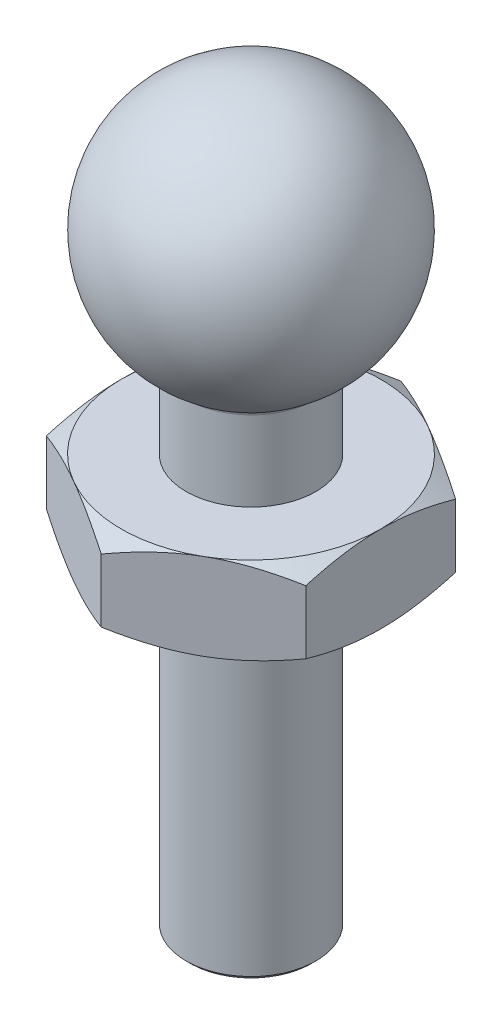
ISO-10303-21;
HEADER;
FILE_DESCRIPTION(('STEP AP214'),'2;1');
FILE_NAME('part.step','',(''),(''),'','','');
FILE_SCHEMA(('AUTOMOTIVE_DESIGN { 1 0 10303 214 1 1 1 1 }'));
ENDSEC;
DATA;
#1=APPLICATION_CONTEXT('core data for automotive mechanical design processes');
#2=APPLICATION_PROTOCOL_DEFINITION('international standard','automotive_design',2000,#1);
#3=PRODUCT_CONTEXT('',#1,'mechanical');
#4=PRODUCT('Part','Part','',(#3));
#5=PRODUCT_RELATED_PRODUCT_CATEGORY('part','',(#4));
#6=PRODUCT_DEFINITION_FORMATION('','',#4);
#7=PRODUCT_DEFINITION_CONTEXT('part definition',#1,'design');
#8=PRODUCT_DEFINITION('design','',#6,#7);
#9=PRODUCT_DEFINITION_SHAPE('','',#8);
#10=(LENGTH_UNIT() NAMED_UNIT(*) SI_UNIT(.MILLI.,.METRE.));
#11=(NAMED_UNIT(*) PLANE_ANGLE_UNIT() SI_UNIT($,.RADIAN.));
#12=(NAMED_UNIT(*) SI_UNIT($,.STERADIAN.) SOLID_ANGLE_UNIT());
#13=UNCERTAINTY_MEASURE_WITH_UNIT(LENGTH_MEASURE(1.E-05),#10,'distance_accuracy_value','');
#14=(GEOMETRIC_REPRESENTATION_CONTEXT(3) GLOBAL_UNCERTAINTY_ASSIGNED_CONTEXT((#13)) GLOBAL_UNIT_ASSIGNED_CONTEXT((#10,
#11,#12)) REPRESENTATION_CONTEXT('',''));
#15=CARTESIAN_POINT('',(0.,0.,0.));
#16=DIRECTION('',(0.,0.,1.));
#17=DIRECTION('',(1.,0.,0.));
#18=AXIS2_PLACEMENT_3D('',#15,#16,#17);
#19=CARTESIAN_POINT('',(3.,9.5,-1.73205080756888));
#20=DIRECTION('',(-0.5,0.,0.866025403784439));
#21=DIRECTION('',(0.866025403784439,0.,0.5));
#22=AXIS2_PLACEMENT_3D('',#19,#20,#21);
#23=PLANE('',#22);
#24=CARTESIAN_POINT('',(3.0002,9.23198413756899,-1.73193533751504));
#25=CARTESIAN_POINT('',(2.86836479341167,9.2759462955477,-1.80805042952748));
#26=CARTESIAN_POINT('',(2.73539159464475,9.31592841370737,-1.88482254163057));
#27=CARTESIAN_POINT('',(2.46714257999794,9.38571791955454,-2.03969618244675));
#28=CARTESIAN_POINT('',(2.33186199736566,9.41550061773462,-2.11780046324563));
#29=CARTESIAN_POINT('',(2.06297739790352,9.46186216078875,-2.27304105912605));
#30=CARTESIAN_POINT('',(1.92941475457054,9.47874955887705,-2.35015348720802));
#31=CARTESIAN_POINT('',(1.66166094270431,9.49891035755148,-2.50474122256553));
#32=CARTESIAN_POINT('',(1.52747074752016,9.50220045221892,-2.58221596787771));
#33=CARTESIAN_POINT('',(1.27672440230419,9.49535946911461,-2.72698443778646));
#34=CARTESIAN_POINT('',(1.16013073502732,9.48690808580739,-2.79429982297457));
#35=CARTESIAN_POINT('',(0.927703015025363,9.46012105699297,-2.92849202968483));
#36=CARTESIAN_POINT('',(0.811869766348668,9.44177625913829,-2.99536838698943));
#37=CARTESIAN_POINT('',(0.578962742943631,9.39591524914668,-3.12983731964848));
#38=CARTESIAN_POINT('',(0.461918449486058,9.36820461473692,-3.19741287398332));
#39=CARTESIAN_POINT('',(0.229575649500875,9.3053122048626,-3.33155605209904));
#40=CARTESIAN_POINT('',(0.114274165828893,9.27014520897844,-3.39812539473502));
#41=CARTESIAN_POINT('',(-0.000200000000000737,9.23198413756899,-3.46421708519159));
#42=B_SPLINE_CURVE_WITH_KNOTS('',3,(#24,#25,#26,#27,#28,#29,#30,#31,#32,#33,#34,#35,#36,#37,#38,
#39,#40,#41),.UNSPECIFIED.,.F.,.F.,(4,2,2,2,2,2,2,2,4),(0.,0.47553983010304,0.952222784107964,
1.41710776961288,1.88142182298026,2.28572436316091,2.69040156475039,3.10405572063576,
3.5168974940707),.UNSPECIFIED.);
#43=CARTESIAN_POINT('',(3.,9.2320508075689,-1.73205080756891));
#44=VERTEX_POINT('',#43);
#45=CARTESIAN_POINT('',(1.5,9.5,-2.59807621135332));
#46=VERTEX_POINT('',#45);
#47=EDGE_CURVE('E138',#44,#46,#42,.T.);
#48=ORIENTED_EDGE('',*,*,#47,.F.);
#49=DIRECTION('',(0.,-1.,0.));
#50=VECTOR('',#49,1.);
#51=CARTESIAN_POINT('',(3.,9.5,-1.73205080756888));
#52=LINE('',#51,#50);
#53=CARTESIAN_POINT('',(3.,7.76794919243112,-1.73205080756888));
#54=VERTEX_POINT('',#53);
#55=EDGE_CURVE('E247',#44,#54,#52,.T.);
#56=ORIENTED_EDGE('',*,*,#55,.T.);
#57=CARTESIAN_POINT('',(-0.000200000000000841,7.76801586243101,-3.46421708519159));
#58=CARTESIAN_POINT('',(0.131635206588331,7.72405370445231,-3.38810199317915));
#59=CARTESIAN_POINT('',(0.264608405355249,7.68407158629263,-3.31132988107606));
#60=CARTESIAN_POINT('',(0.532857420002056,7.61428208044547,-3.15645624025988));
#61=CARTESIAN_POINT('',(0.668138002634341,7.58449938226538,-3.078351959461));
#62=CARTESIAN_POINT('',(0.937022602096483,7.53813783921126,-2.92311136358059));
#63=CARTESIAN_POINT('',(1.07058524542946,7.52125044112295,-2.84599893549861));
#64=CARTESIAN_POINT('',(1.33833905729569,7.50108964244852,-2.6914112001411));
#65=CARTESIAN_POINT('',(1.47252925247984,7.49779954778108,-2.61393645482892));
#66=CARTESIAN_POINT('',(1.72327559769581,7.50464053088539,-2.46916798492017));
#67=CARTESIAN_POINT('',(1.83986926497268,7.51309191419262,-2.40185259973206));
#68=CARTESIAN_POINT('',(2.07229698497464,7.53987894300704,-2.2676603930218));
#69=CARTESIAN_POINT('',(2.18813023365133,7.55822374086171,-2.2007840357172));
#70=CARTESIAN_POINT('',(2.42103725705637,7.60408475085333,-2.06631510305815));
#71=CARTESIAN_POINT('',(2.53808155051394,7.63179538526308,-1.99873954872331));
#72=CARTESIAN_POINT('',(2.77042435049913,7.6946877951374,-1.86459637060759));
#73=CARTESIAN_POINT('',(2.88572583417111,7.72985479102156,-1.79802702797161));
#74=CARTESIAN_POINT('',(3.0002,7.76801586243101,-1.73193533751504));
#75=B_SPLINE_CURVE_WITH_KNOTS('',3,(#57,#58,#59,#60,#61,#62,#63,#64,#65,#66,#67,#68,#69,#70,#71,
#72,#73,#74),.UNSPECIFIED.,.F.,.F.,(4,2,2,2,2,2,2,2,4),(0.,0.475539830103041,0.952222784107964,
1.41710776961288,1.88142182298026,2.28572436316091,2.69040156475039,3.10405572063576,
3.5168974940707),.UNSPECIFIED.);
#76=CARTESIAN_POINT('',(1.5,7.5,-2.59807621135332));
#77=VERTEX_POINT('',#76);
#78=EDGE_CURVE('E287',#77,#54,#75,.T.);
#79=ORIENTED_EDGE('',*,*,#78,.F.);
#80=CARTESIAN_POINT('',(0.,7.76794919243112,-3.46410161513775));
#81=VERTEX_POINT('',#80);
#82=EDGE_CURVE('E294',#81,#77,#75,.T.);
#83=ORIENTED_EDGE('',*,*,#82,.F.);
#84=DIRECTION('',(0.,-1.,0.));
#85=VECTOR('',#84,1.);
#86=CARTESIAN_POINT('',(0.,9.5,-3.46410161513775));
#87=LINE('',#86,#85);
#88=CARTESIAN_POINT('',(0.,9.23205080756888,-3.46410161513775));
#89=VERTEX_POINT('',#88);
#90=EDGE_CURVE('E161',#89,#81,#87,.T.);
#91=ORIENTED_EDGE('',*,*,#90,.F.);
#92=EDGE_CURVE('E147',#46,#89,#42,.T.);
#93=ORIENTED_EDGE('',*,*,#92,.F.);
#94=EDGE_LOOP('',(#48,#56,#79,#83,#91,#93));
#95=FACE_BOUND('',#94,.T.);
#96=ADVANCED_FACE('F50',(#95),#23,.F.);
#97=CARTESIAN_POINT('',(0.,9.5,-3.46410161513775));
#98=DIRECTION('',(0.5,0.,0.866025403784439));
#99=DIRECTION('',(0.866025403784439,0.,-0.5));
#100=AXIS2_PLACEMENT_3D('',#97,#98,#99);
#101=PLANE('',#100);
#102=CARTESIAN_POINT('',(0.000199999999999262,9.23198413756899,-3.46421708519159));
#103=CARTESIAN_POINT('',(-0.131635206588332,9.2759462955477,-3.38810199317915));
#104=CARTESIAN_POINT('',(-0.26460840535525,9.31592841370737,-3.31132988107606));
#105=CARTESIAN_POINT('',(-0.532857420002056,9.38571791955454,-3.15645624025988));
#106=CARTESIAN_POINT('',(-0.668138002634342,9.41550061773462,-3.078351959461));
#107=CARTESIAN_POINT('',(-0.937022602096484,9.46186216078875,-2.92311136358059));
#108=CARTESIAN_POINT('',(-1.07058524542946,9.47874955887705,-2.84599893549861));
#109=CARTESIAN_POINT('',(-1.33833905729569,9.49891035755148,-2.6914112001411));
#110=CARTESIAN_POINT('',(-1.47252925247984,9.50220045221892,-2.61393645482892));
#111=CARTESIAN_POINT('',(-1.72327559769581,9.49535946911461,-2.46916798492017));
#112=CARTESIAN_POINT('',(-1.83986926497268,9.48690808580738,-2.40185259973206));
#113=CARTESIAN_POINT('',(-2.07229698497464,9.46012105699297,-2.2676603930218));
#114=CARTESIAN_POINT('',(-2.18813023365133,9.44177625913829,-2.2007840357172));
#115=CARTESIAN_POINT('',(-2.42103725705637,9.39591524914668,-2.06631510305815));
#116=CARTESIAN_POINT('',(-2.53808155051394,9.36820461473692,-1.99873954872331));
#117=CARTESIAN_POINT('',(-2.77042435049912,9.3053122048626,-1.86459637060759));
#118=CARTESIAN_POINT('',(-2.8857258341711,9.27014520897845,-1.79802702797161));
#119=CARTESIAN_POINT('',(-3.0002,9.23198413756899,-1.73193533751504));
#120=B_SPLINE_CURVE_WITH_KNOTS('',3,(#102,#103,#104,#105,#106,#107,#108,#109,#110,#111,#112,
#113,#114,#115,#116,#117,#118,#119),.UNSPECIFIED.,.F.,.F.,(4,2,2,2,2,2,2,2,4),(0.,
0.475539830103041,0.952222784107964,1.41710776961288,1.88142182298026,2.28572436316091,
2.69040156475039,3.10405572063576,3.5168974940707),.UNSPECIFIED.);
#121=CARTESIAN_POINT('',(-1.5,9.5,-2.59807621135332));
#122=VERTEX_POINT('',#121);
#123=EDGE_CURVE('E153',#89,#122,#120,.T.);
#124=ORIENTED_EDGE('',*,*,#123,.F.);
#125=ORIENTED_EDGE('',*,*,#90,.T.);
#126=CARTESIAN_POINT('',(-3.0002,7.76801586243101,-1.73193533751504));
#127=CARTESIAN_POINT('',(-2.86836479341167,7.72405370445231,-1.80805042952748));
#128=CARTESIAN_POINT('',(-2.73539159464475,7.68407158629263,-1.88482254163057));
#129=CARTESIAN_POINT('',(-2.46714257999794,7.61428208044547,-2.03969618244675));
#130=CARTESIAN_POINT('',(-2.33186199736566,7.58449938226538,-2.11780046324563));
#131=CARTESIAN_POINT('',(-2.06297739790352,7.53813783921126,-2.27304105912605));
#132=CARTESIAN_POINT('',(-1.92941475457054,7.52125044112295,-2.35015348720802));
#133=CARTESIAN_POINT('',(-1.66166094270431,7.50108964244852,-2.50474122256553));
#134=CARTESIAN_POINT('',(-1.52747074752016,7.49779954778108,-2.58221596787771));
#135=CARTESIAN_POINT('',(-1.27672440230419,7.50464053088539,-2.72698443778647));
#136=CARTESIAN_POINT('',(-1.16013073502732,7.51309191419262,-2.79429982297457));
#137=CARTESIAN_POINT('',(-0.927703015025364,7.53987894300704,-2.92849202968483));
#138=CARTESIAN_POINT('',(-0.811869766348669,7.55822374086171,-2.99536838698943));
#139=CARTESIAN_POINT('',(-0.578962742943633,7.60408475085333,-3.12983731964848));
#140=CARTESIAN_POINT('',(-0.461918449486061,7.63179538526308,-3.19741287398332));
#141=CARTESIAN_POINT('',(-0.229575649500877,7.6946877951374,-3.33155605209904));
#142=CARTESIAN_POINT('',(-0.114274165828895,7.72985479102156,-3.39812539473502));
#143=CARTESIAN_POINT('',(0.000199999999998709,7.76801586243101,-3.46421708519159));
#144=B_SPLINE_CURVE_WITH_KNOTS('',3,(#126,#127,#128,#129,#130,#131,#132,#133,#134,#135,#136,
#137,#138,#139,#140,#141,#142,#143),.UNSPECIFIED.,.F.,.F.,(4,2,2,2,2,2,2,2,4),(0.,
0.475539830103039,0.952222784107963,1.41710776961288,1.88142182298026,2.28572436316091,
2.69040156475039,3.10405572063576,3.5168974940707),.UNSPECIFIED.);
#145=CARTESIAN_POINT('',(-1.5,7.5,-2.59807621135332));
#146=VERTEX_POINT('',#145);
#147=EDGE_CURVE('E238',#146,#81,#144,.T.);
#148=ORIENTED_EDGE('',*,*,#147,.F.);
#149=CARTESIAN_POINT('',(-3.,7.76794919243112,-1.73205080756888));
#150=VERTEX_POINT('',#149);
#151=EDGE_CURVE('E306',#150,#146,#144,.T.);
#152=ORIENTED_EDGE('',*,*,#151,.F.);
#153=DIRECTION('',(0.,-1.,0.));
#154=VECTOR('',#153,1.);
#155=CARTESIAN_POINT('',(-3.,9.5,-1.73205080756888));
#156=LINE('',#155,#154);
#157=CARTESIAN_POINT('',(-3.,9.23205080756888,-1.73205080756888));
#158=VERTEX_POINT('',#157);
#159=EDGE_CURVE('E258',#158,#150,#156,.T.);
#160=ORIENTED_EDGE('',*,*,#159,.F.);
#161=EDGE_CURVE('E162',#122,#158,#120,.T.);
#162=ORIENTED_EDGE('',*,*,#161,.F.);
#163=EDGE_LOOP('',(#124,#125,#148,#152,#160,#162));
#164=FACE_BOUND('',#163,.T.);
#165=ADVANCED_FACE('F222',(#164),#101,.F.);
#166=CARTESIAN_POINT('',(-3.,9.5,-1.73205080756888));
#167=DIRECTION('',(1.,0.,0.));
#168=DIRECTION('',(0.,0.,-1.));
#169=AXIS2_PLACEMENT_3D('',#166,#167,#168);
#170=PLANE('',#169);
#171=CARTESIAN_POINT('',(-3.,7.49669275597267,-5.73225080756888));
#172=CARTESIAN_POINT('',(-3.,7.56535762873895,-5.59799811373669));
#173=CARTESIAN_POINT('',(-3.,7.63362658074956,-5.46354106552017));
#174=CARTESIAN_POINT('',(-3.,7.76917519775031,-5.19412594711896));
#175=CARTESIAN_POINT('',(-3.,7.83645484167597,-5.05916786634262));
#176=CARTESIAN_POINT('',(-3.,7.96993872408742,-4.78843231789163));
#177=CARTESIAN_POINT('',(-3.,8.0361409223391,-4.65265384244875));
#178=CARTESIAN_POINT('',(-3.,8.16708055525372,-4.38038885038152));
#179=CARTESIAN_POINT('',(-3.,8.23181796851999,-4.24390232345014));
#180=CARTESIAN_POINT('',(-3.,8.36273075239076,-3.96310511366176));
#181=CARTESIAN_POINT('',(-3.,8.42881132731156,-3.81875010473635));
#182=CARTESIAN_POINT('',(-3.,8.55842928727965,-3.52890389215656));
#183=CARTESIAN_POINT('',(-3.,8.62196674541402,-3.38341272129836));
#184=CARTESIAN_POINT('',(-3.,8.74573518476893,-3.0911428032025));
#185=CARTESIAN_POINT('',(-3.,8.80596844827942,-2.94436502804428));
#186=CARTESIAN_POINT('',(-3.,8.92221294586851,-2.64909731827644));
#187=CARTESIAN_POINT('',(-3.,8.97822314680859,-2.50060697487877));
#188=CARTESIAN_POINT('',(-3.,9.09420348606466,-2.17495473766773));
#189=CARTESIAN_POINT('',(-3.,9.15309774811247,-1.99740334689548));
#190=CARTESIAN_POINT('',(-3.,9.26029523419007,-1.63917764376158));
#191=CARTESIAN_POINT('',(-3.,9.30860404614459,-1.45850503366086));
#192=CARTESIAN_POINT('',(-3.,9.39023263279609,-1.09720914532956));
#193=CARTESIAN_POINT('',(-3.,9.42381477693698,-0.916647599895757));
#194=CARTESIAN_POINT('',(-3.,9.46126742176692,-0.644079261802787));
#195=CARTESIAN_POINT('',(-3.,9.47159787377879,-0.552943422867094));
#196=CARTESIAN_POINT('',(-3.,9.48763454600052,-0.370270654947727));
#197=CARTESIAN_POINT('',(-3.,9.49334144079801,-0.278733786435309));
#198=CARTESIAN_POINT('',(-3.,9.49996614854262,-0.0944078517722086));
#199=CARTESIAN_POINT('',(-3.,9.5008268616344,-0.00161671746076026));
#200=CARTESIAN_POINT('',(-3.,9.49757525562797,0.1838775984138));
#201=CARTESIAN_POINT('',(-3.,9.49346292019229,0.276580779686968));
#202=CARTESIAN_POINT('',(-3.,9.48041370767168,0.461668088480514));
#203=CARTESIAN_POINT('',(-3.,9.47147558711607,0.554052127589443));
#204=CARTESIAN_POINT('',(-3.,9.4490819835307,0.738276464049773));
#205=CARTESIAN_POINT('',(-3.,9.43562578745626,0.830116673244043));
#206=CARTESIAN_POINT('',(-3.,9.38848678345654,1.1081241349506));
#207=CARTESIAN_POINT('',(-3.,9.34831083516922,1.29320289274649));
#208=CARTESIAN_POINT('',(-3.,9.25483304091392,1.65992833453579));
#209=CARTESIAN_POINT('',(-3.,9.20152817481691,1.8415742184766));
#210=CARTESIAN_POINT('',(-3.,9.09001482170303,2.18718321983853));
#211=CARTESIAN_POINT('',(-3.,9.03254960886739,2.35139002090273));
#212=CARTESIAN_POINT('',(-3.,8.91157770593577,2.67757637701535));
#213=CARTESIAN_POINT('',(-3.,8.84806982210383,2.83955548471668));
#214=CARTESIAN_POINT('',(-3.,8.71649668995848,3.16180541641892));
#215=CARTESIAN_POINT('',(-3.,8.64842746398323,3.32207460435457));
#216=CARTESIAN_POINT('',(-3.,8.50888164672137,3.64112437712565));
#217=CARTESIAN_POINT('',(-3.,8.43740489080743,3.79990488959462));
#218=CARTESIAN_POINT('',(-3.,8.29572041514807,4.10783154121877));
#219=CARTESIAN_POINT('',(-3.,8.22564804300013,4.25704019529893));
#220=CARTESIAN_POINT('',(-3.,8.0836551872923,4.55457880885657));
#221=CARTESIAN_POINT('',(-3.,8.01173465191385,4.70290874355283));
#222=CARTESIAN_POINT('',(-3.,7.86663085724281,4.99841900754648));
#223=CARTESIAN_POINT('',(-3.,7.79345182235509,5.14560141584992));
#224=CARTESIAN_POINT('',(-3.,7.64590152942626,5.43935321353677));
#225=CARTESIAN_POINT('',(-3.,7.57153036655204,5.58592265068707));
#226=CARTESIAN_POINT('',(-3.,7.49669275597267,5.73225080756888));
#227=B_SPLINE_CURVE_WITH_KNOTS('',3,(#171,#172,#173,#174,#175,#176,#177,#178,#179,#180,#181,
#182,#183,#184,#185,#186,#187,#188,#189,#190,#191,#192,#193,#194,#195,#196,#197,#198,#199,#200,
#201,#202,#203,#204,#205,#206,#207,#208,#209,#210,#211,#212,#213,#214,#215,#216,#217,#218,#219,
#220,#221,#222,#223,#224,#225,#226),.UNSPECIFIED.,.F.,.F.,(4,2,2,2,2,2,2,2,2,2,2,2,2,2,2,2,2,2,
2,2,2,2,2,2,2,2,2,4),(0.,0.452382016001323,0.90477365026535,1.35794045354517,1.81111387213612,
2.2873771437625,2.76362671813268,3.23954308217786,3.71557550010852,4.27652369616462,
4.83717505756687,5.38738613645124,5.66244417939779,5.937462083513,6.21571369559986,
6.4939662218021,6.77229048018743,7.05065868449287,7.61810965270507,8.18569127741243,
8.70745206667822,9.2293161451901,9.75164138486646,10.2739918851653,10.7685068932809,
11.2630357817083,11.756143015984,12.2492110799155),.UNSPECIFIED.);
#228=CARTESIAN_POINT('',(-3.,9.5,0.));
#229=VERTEX_POINT('',#228);
#230=EDGE_CURVE('E216',#158,#229,#227,.T.);
#231=ORIENTED_EDGE('',*,*,#230,.F.);
#232=ORIENTED_EDGE('',*,*,#159,.T.);
#233=CARTESIAN_POINT('',(-3.,9.50330724402733,5.73225080756888));
#234=CARTESIAN_POINT('',(-3.,9.43464237126106,5.59799811373669));
#235=CARTESIAN_POINT('',(-3.,9.36637341925044,5.46354106552018));
#236=CARTESIAN_POINT('',(-3.,9.2308248022497,5.19412594711896));
#237=CARTESIAN_POINT('',(-3.,9.16354515832403,5.05916786634262));
#238=CARTESIAN_POINT('',(-3.,9.03006127591258,4.78843231789163));
#239=CARTESIAN_POINT('',(-3.,8.9638590776609,4.65265384244875));
#240=CARTESIAN_POINT('',(-3.,8.83291944474628,4.38038885038151));
#241=CARTESIAN_POINT('',(-3.,8.76818203148001,4.24390232345014));
#242=CARTESIAN_POINT('',(-3.,8.63726924760924,3.96310511366176));
#243=CARTESIAN_POINT('',(-3.,8.57118867268844,3.81875010473635));
#244=CARTESIAN_POINT('',(-3.,8.44157071272035,3.52890389215656));
#245=CARTESIAN_POINT('',(-3.,8.37803325458598,3.38341272129836));
#246=CARTESIAN_POINT('',(-3.,8.25426481523107,3.0911428032025));
#247=CARTESIAN_POINT('',(-3.,8.19403155172058,2.94436502804428));
#248=CARTESIAN_POINT('',(-3.,8.07778705413149,2.64909731827644));
#249=CARTESIAN_POINT('',(-3.,8.02177685319141,2.50060697487877));
#250=CARTESIAN_POINT('',(-3.,7.90579651393534,2.17495473766773));
#251=CARTESIAN_POINT('',(-3.,7.84690225188754,1.99740334689548));
#252=CARTESIAN_POINT('',(-3.,7.73970476580994,1.63917764376158));
#253=CARTESIAN_POINT('',(-3.,7.69139595385541,1.45850503366086));
#254=CARTESIAN_POINT('',(-3.,7.60976736720391,1.09720914532956));
#255=CARTESIAN_POINT('',(-3.,7.57618522306302,0.916647599895758));
#256=CARTESIAN_POINT('',(-3.,7.53873257823308,0.644079261802788));
#257=CARTESIAN_POINT('',(-3.,7.52840212622122,0.552943422867095));
#258=CARTESIAN_POINT('',(-3.,7.51236545399948,0.370270654947728));
#259=CARTESIAN_POINT('',(-3.,7.50665855920199,0.27873378643531));
#260=CARTESIAN_POINT('',(-3.,7.50003385145738,0.0944078517722091));
#261=CARTESIAN_POINT('',(-3.,7.4991731383656,0.00161671746076089));
#262=CARTESIAN_POINT('',(-3.,7.50242474437203,-0.1838775984138));
#263=CARTESIAN_POINT('',(-3.,7.50653707980771,-0.276580779686967));
#264=CARTESIAN_POINT('',(-3.,7.51958629232832,-0.461668088480514));
#265=CARTESIAN_POINT('',(-3.,7.52852441288393,-0.554052127589442));
#266=CARTESIAN_POINT('',(-3.,7.5509180164693,-0.738276464049773));
#267=CARTESIAN_POINT('',(-3.,7.56437421254374,-0.830116673244042));
#268=CARTESIAN_POINT('',(-3.,7.61151321654347,-1.1081241349506));
#269=CARTESIAN_POINT('',(-3.,7.65168916483078,-1.29320289274649));
#270=CARTESIAN_POINT('',(-3.,7.74516695908608,-1.65992833453579));
#271=CARTESIAN_POINT('',(-3.,7.79847182518309,-1.8415742184766));
#272=CARTESIAN_POINT('',(-3.,7.90998517829698,-2.18718321983853));
#273=CARTESIAN_POINT('',(-3.,7.96745039113262,-2.35139002090273));
#274=CARTESIAN_POINT('',(-3.,8.08842229406424,-2.67757637701535));
#275=CARTESIAN_POINT('',(-3.,8.15193017789617,-2.83955548471668));
#276=CARTESIAN_POINT('',(-3.,8.28350331004152,-3.16180541641892));
#277=CARTESIAN_POINT('',(-3.,8.35157253601678,-3.32207460435457));
#278=CARTESIAN_POINT('',(-3.,8.49111835327863,-3.64112437712565));
#279=CARTESIAN_POINT('',(-3.,8.56259510919257,-3.79990488959462));
#280=CARTESIAN_POINT('',(-3.,8.70427958485193,-4.10783154121877));
#281=CARTESIAN_POINT('',(-3.,8.77435195699988,-4.25704019529893));
#282=CARTESIAN_POINT('',(-3.,8.9163448127077,-4.55457880885657));
#283=CARTESIAN_POINT('',(-3.,8.98826534808616,-4.70290874355283));
#284=CARTESIAN_POINT('',(-3.,9.13336914275719,-4.99841900754648));
#285=CARTESIAN_POINT('',(-3.,9.20654817764491,-5.14560141584992));
#286=CARTESIAN_POINT('',(-3.,9.35409847057374,-5.43935321353677));
#287=CARTESIAN_POINT('',(-3.,9.42846963344796,-5.58592265068707));
#288=CARTESIAN_POINT('',(-3.,9.50330724402733,-5.73225080756888));
#289=B_SPLINE_CURVE_WITH_KNOTS('',3,(#233,#234,#235,#236,#237,#238,#239,#240,#241,#242,#243,
#244,#245,#246,#247,#248,#249,#250,#251,#252,#253,#254,#255,#256,#257,#258,#259,#260,#261,#262,
#263,#264,#265,#266,#267,#268,#269,#270,#271,#272,#273,#274,#275,#276,#277,#278,#279,#280,#281,
#282,#283,#284,#285,#286,#287,#288),.UNSPECIFIED.,.F.,.F.,(4,2,2,2,2,2,2,2,2,2,2,2,2,2,2,2,2,2,
2,2,2,2,2,2,2,2,2,4),(0.,0.452382016001322,0.904773650265349,1.35794045354517,1.81111387213612,
2.2873771437625,2.76362671813268,3.23954308217786,3.71557550010852,4.27652369616462,
4.83717505756687,5.38738613645124,5.66244417939779,5.937462083513,6.21571369559986,
6.4939662218021,6.77229048018743,7.05065868449287,7.61810965270507,8.18569127741243,
8.70745206667822,9.2293161451901,9.75164138486645,10.2739918851653,10.7685068932809,
11.2630357817083,11.756143015984,12.2492110799155),.UNSPECIFIED.);
#290=CARTESIAN_POINT('',(-3.,7.5,0.));
#291=VERTEX_POINT('',#290);
#292=EDGE_CURVE('E228',#291,#150,#289,.T.);
#293=ORIENTED_EDGE('',*,*,#292,.F.);
#294=CARTESIAN_POINT('',(-3.,7.76794919243112,1.73205080756888));
#295=VERTEX_POINT('',#294);
#296=EDGE_CURVE('E236',#295,#291,#289,.T.);
#297=ORIENTED_EDGE('',*,*,#296,.F.);
#298=DIRECTION('',(0.,-1.,0.));
#299=VECTOR('',#298,1.);
#300=CARTESIAN_POINT('',(-3.,9.5,1.73205080756888));
#301=LINE('',#300,#299);
#302=CARTESIAN_POINT('',(-3.,9.23205080756888,1.73205080756888));
#303=VERTEX_POINT('',#302);
#304=EDGE_CURVE('E256',#303,#295,#301,.T.);
#305=ORIENTED_EDGE('',*,*,#304,.F.);
#306=EDGE_CURVE('E210',#229,#303,#227,.T.);
#307=ORIENTED_EDGE('',*,*,#306,.F.);
#308=EDGE_LOOP('',(#231,#232,#293,#297,#305,#307));
#309=FACE_BOUND('',#308,.T.);
#310=ADVANCED_FACE('F218',(#309),#170,.F.);
#311=CARTESIAN_POINT('',(-3.,9.5,1.73205080756888));
#312=DIRECTION('',(0.5,0.,-0.866025403784439));
#313=DIRECTION('',(-0.866025403784439,0.,-0.5));
#314=AXIS2_PLACEMENT_3D('',#311,#312,#313);
#315=PLANE('',#314);
#316=CARTESIAN_POINT('',(-3.0002,9.23198413756899,1.73193533751504));
#317=CARTESIAN_POINT('',(-2.86836479341167,9.2759462955477,1.80805042952748));
#318=CARTESIAN_POINT('',(-2.73539159464475,9.31592841370737,1.88482254163057));
#319=CARTESIAN_POINT('',(-2.46714257999794,9.38571791955454,2.03969618244675));
#320=CARTESIAN_POINT('',(-2.33186199736566,9.41550061773462,2.11780046324563));
#321=CARTESIAN_POINT('',(-2.06297739790352,9.46186216078875,2.27304105912605));
#322=CARTESIAN_POINT('',(-1.92941475457054,9.47874955887705,2.35015348720802));
#323=CARTESIAN_POINT('',(-1.66166094270431,9.49891035755148,2.50474122256553));
#324=CARTESIAN_POINT('',(-1.52747074752016,9.50220045221892,2.58221596787771));
#325=CARTESIAN_POINT('',(-1.27672440230419,9.49535946911461,2.72698443778647));
#326=CARTESIAN_POINT('',(-1.16013073502732,9.48690808580738,2.79429982297457));
#327=CARTESIAN_POINT('',(-0.927703015025363,9.46012105699297,2.92849202968483));
#328=CARTESIAN_POINT('',(-0.811869766348668,9.44177625913829,2.99536838698943));
#329=CARTESIAN_POINT('',(-0.578962742943632,9.39591524914668,3.12983731964848));
#330=CARTESIAN_POINT('',(-0.461918449486059,9.36820461473692,3.19741287398332));
#331=CARTESIAN_POINT('',(-0.229575649500875,9.3053122048626,3.33155605209904));
#332=CARTESIAN_POINT('',(-0.114274165828894,9.27014520897844,3.39812539473502));
#333=CARTESIAN_POINT('',(0.000199999999999832,9.23198413756899,3.46421708519159));
#334=B_SPLINE_CURVE_WITH_KNOTS('',3,(#316,#317,#318,#319,#320,#321,#322,#323,#324,#325,#326,
#327,#328,#329,#330,#331,#332,#333),.UNSPECIFIED.,.F.,.F.,(4,2,2,2,2,2,2,2,4),(0.,
0.475539830103041,0.952222784107964,1.41710776961288,1.88142182298026,2.28572436316091,
2.69040156475039,3.10405572063576,3.5168974940707),.UNSPECIFIED.);
#335=CARTESIAN_POINT('',(-1.5,9.5,2.59807621135332));
#336=VERTEX_POINT('',#335);
#337=EDGE_CURVE('E217',#303,#336,#334,.T.);
#338=ORIENTED_EDGE('',*,*,#337,.F.);
#339=ORIENTED_EDGE('',*,*,#304,.T.);
#340=CARTESIAN_POINT('',(0.0002,7.76801586243101,3.46421708519159));
#341=CARTESIAN_POINT('',(-0.131635206588332,7.72405370445231,3.38810199317915));
#342=CARTESIAN_POINT('',(-0.264608405355249,7.68407158629263,3.31132988107606));
#343=CARTESIAN_POINT('',(-0.532857420002056,7.61428208044547,3.15645624025988));
#344=CARTESIAN_POINT('',(-0.668138002634342,7.58449938226538,3.078351959461));
#345=CARTESIAN_POINT('',(-0.937022602096483,7.53813783921126,2.92311136358059));
#346=CARTESIAN_POINT('',(-1.07058524542946,7.52125044112295,2.84599893549861));
#347=CARTESIAN_POINT('',(-1.33833905729569,7.50108964244852,2.6914112001411));
#348=CARTESIAN_POINT('',(-1.47252925247984,7.49779954778108,2.61393645482892));
#349=CARTESIAN_POINT('',(-1.72327559769581,7.50464053088539,2.46916798492017));
#350=CARTESIAN_POINT('',(-1.83986926497268,7.51309191419262,2.40185259973206));
#351=CARTESIAN_POINT('',(-2.07229698497464,7.53987894300704,2.2676603930218));
#352=CARTESIAN_POINT('',(-2.18813023365133,7.55822374086171,2.2007840357172));
#353=CARTESIAN_POINT('',(-2.42103725705637,7.60408475085333,2.06631510305815));
#354=CARTESIAN_POINT('',(-2.53808155051394,7.63179538526308,1.99873954872331));
#355=CARTESIAN_POINT('',(-2.77042435049912,7.6946877951374,1.86459637060759));
#356=CARTESIAN_POINT('',(-2.88572583417111,7.72985479102156,1.79802702797161));
#357=CARTESIAN_POINT('',(-3.0002,7.76801586243101,1.73193533751504));
#358=B_SPLINE_CURVE_WITH_KNOTS('',3,(#340,#341,#342,#343,#344,#345,#346,#347,#348,#349,#350,
#351,#352,#353,#354,#355,#356,#357),.UNSPECIFIED.,.F.,.F.,(4,2,2,2,2,2,2,2,4),(0.,
0.475539830103041,0.952222784107964,1.41710776961288,1.88142182298026,2.28572436316091,
2.69040156475039,3.10405572063576,3.5168974940707),.UNSPECIFIED.);
#359=CARTESIAN_POINT('',(-1.5,7.5,2.59807621135332));
#360=VERTEX_POINT('',#359);
#361=EDGE_CURVE('E237',#360,#295,#358,.T.);
#362=ORIENTED_EDGE('',*,*,#361,.F.);
#363=CARTESIAN_POINT('',(0.,7.76794919243112,3.46410161513775));
#364=VERTEX_POINT('',#363);
#365=EDGE_CURVE('E295',#364,#360,#358,.T.);
#366=ORIENTED_EDGE('',*,*,#365,.F.);
#367=DIRECTION('',(0.,-1.,0.));
#368=VECTOR('',#367,1.);
#369=CARTESIAN_POINT('',(0.,9.5,3.46410161513775));
#370=LINE('',#369,#368);
#371=CARTESIAN_POINT('',(0.,9.23205080756888,3.46410161513775));
#372=VERTEX_POINT('',#371);
#373=EDGE_CURVE('E254',#372,#364,#370,.T.);
#374=ORIENTED_EDGE('',*,*,#373,.F.);
#375=EDGE_CURVE('E204',#336,#372,#334,.T.);
#376=ORIENTED_EDGE('',*,*,#375,.F.);
#377=EDGE_LOOP('',(#338,#339,#362,#366,#374,#376));
#378=FACE_BOUND('',#377,.T.);
#379=ADVANCED_FACE('F221',(#378),#315,.F.);
#380=CARTESIAN_POINT('',(0.,9.5,3.46410161513775));
#381=DIRECTION('',(-0.5,0.,-0.866025403784439));
#382=DIRECTION('',(-0.866025403784439,0.,0.5));
#383=AXIS2_PLACEMENT_3D('',#380,#381,#382);
#384=PLANE('',#383);
#385=CARTESIAN_POINT('',(-0.000200000000000161,9.23198413756899,3.46421708519159));
#386=CARTESIAN_POINT('',(0.131635206588331,9.2759462955477,3.38810199317915));
#387=CARTESIAN_POINT('',(0.264608405355249,9.31592841370737,3.31132988107606));
#388=CARTESIAN_POINT('',(0.532857420002055,9.38571791955454,3.15645624025988));
#389=CARTESIAN_POINT('',(0.668138002634341,9.41550061773462,3.078351959461));
#390=CARTESIAN_POINT('',(0.937022602096483,9.46186216078875,2.92311136358059));
#391=CARTESIAN_POINT('',(1.07058524542946,9.47874955887705,2.84599893549861));
#392=CARTESIAN_POINT('',(1.33833905729569,9.49891035755148,2.6914112001411));
#393=CARTESIAN_POINT('',(1.47252925247984,9.50220045221892,2.61393645482892));
#394=CARTESIAN_POINT('',(1.72327559769581,9.49535946911461,2.46916798492017));
#395=CARTESIAN_POINT('',(1.83986926497268,9.48690808580738,2.40185259973206));
#396=CARTESIAN_POINT('',(2.07229698497464,9.46012105699296,2.2676603930218));
#397=CARTESIAN_POINT('',(2.18813023365133,9.44177625913829,2.2007840357172));
#398=CARTESIAN_POINT('',(2.42103725705637,9.39591524914667,2.06631510305815));
#399=CARTESIAN_POINT('',(2.53808155051394,9.36820461473692,1.99873954872331));
#400=CARTESIAN_POINT('',(2.77042435049913,9.3053122048626,1.86459637060759));
#401=CARTESIAN_POINT('',(2.88572583417111,9.27014520897845,1.79802702797161));
#402=CARTESIAN_POINT('',(3.0002,9.23198413756899,1.73193533751504));
#403=B_SPLINE_CURVE_WITH_KNOTS('',3,(#385,#386,#387,#388,#389,#390,#391,#392,#393,#394,#395,
#396,#397,#398,#399,#400,#401,#402),.UNSPECIFIED.,.F.,.F.,(4,2,2,2,2,2,2,2,4),(0.,
0.47553983010304,0.952222784107964,1.41710776961288,1.88142182298026,2.28572436316091,
2.69040156475039,3.10405572063576,3.5168974940707),.UNSPECIFIED.);
#404=CARTESIAN_POINT('',(1.5,9.5,2.59807621135332));
#405=VERTEX_POINT('',#404);
#406=EDGE_CURVE('E343',#372,#405,#403,.T.);
#407=ORIENTED_EDGE('',*,*,#406,.F.);
#408=ORIENTED_EDGE('',*,*,#373,.T.);
#409=CARTESIAN_POINT('',(3.0002,7.76801586243101,1.73193533751504));
#410=CARTESIAN_POINT('',(2.86836479341167,7.72405370445231,1.80805042952748));
#411=CARTESIAN_POINT('',(2.73539159464475,7.68407158629263,1.88482254163057));
#412=CARTESIAN_POINT('',(2.46714257999794,7.61428208044547,2.03969618244675));
#413=CARTESIAN_POINT('',(2.33186199736566,7.58449938226538,2.11780046324563));
#414=CARTESIAN_POINT('',(2.06297739790352,7.53813783921126,2.27304105912605));
#415=CARTESIAN_POINT('',(1.92941475457054,7.52125044112295,2.35015348720802));
#416=CARTESIAN_POINT('',(1.66166094270431,7.50108964244852,2.50474122256553));
#417=CARTESIAN_POINT('',(1.52747074752016,7.49779954778108,2.58221596787771));
#418=CARTESIAN_POINT('',(1.27672440230419,7.50464053088539,2.72698443778646));
#419=CARTESIAN_POINT('',(1.16013073502732,7.51309191419262,2.79429982297457));
#420=CARTESIAN_POINT('',(0.927703015025364,7.53987894300704,2.92849202968483));
#421=CARTESIAN_POINT('',(0.811869766348669,7.55822374086171,2.99536838698943));
#422=CARTESIAN_POINT('',(0.578962742943633,7.60408475085333,3.12983731964848));
#423=CARTESIAN_POINT('',(0.461918449486059,7.63179538526308,3.19741287398332));
#424=CARTESIAN_POINT('',(0.229575649500875,7.6946877951374,3.33155605209904));
#425=CARTESIAN_POINT('',(0.114274165828894,7.72985479102156,3.39812539473502));
#426=CARTESIAN_POINT('',(-0.000200000000000178,7.76801586243101,3.46421708519159));
#427=B_SPLINE_CURVE_WITH_KNOTS('',3,(#409,#410,#411,#412,#413,#414,#415,#416,#417,#418,#419,
#420,#421,#422,#423,#424,#425,#426),.UNSPECIFIED.,.F.,.F.,(4,2,2,2,2,2,2,2,4),(0.,
0.475539830103041,0.952222784107964,1.41710776961288,1.88142182298026,2.28572436316091,
2.69040156475039,3.10405572063576,3.5168974940707),.UNSPECIFIED.);
#428=CARTESIAN_POINT('',(1.5,7.5,2.59807621135332));
#429=VERTEX_POINT('',#428);
#430=EDGE_CURVE('E288',#429,#364,#427,.T.);
#431=ORIENTED_EDGE('',*,*,#430,.F.);
#432=CARTESIAN_POINT('',(3.,7.7679491924311,1.73205080756891));
#433=VERTEX_POINT('',#432);
#434=EDGE_CURVE('E280',#433,#429,#427,.T.);
#435=ORIENTED_EDGE('',*,*,#434,.F.);
#436=DIRECTION('',(0.,-1.,0.));
#437=VECTOR('',#436,1.);
#438=CARTESIAN_POINT('',(3.,9.5,1.73205080756888));
#439=LINE('',#438,#437);
#440=CARTESIAN_POINT('',(3.,9.23205080756888,1.73205080756888));
#441=VERTEX_POINT('',#440);
#442=EDGE_CURVE('E252',#441,#433,#439,.T.);
#443=ORIENTED_EDGE('',*,*,#442,.F.);
#444=EDGE_CURVE('E196',#405,#441,#403,.T.);
#445=ORIENTED_EDGE('',*,*,#444,.F.);
#446=EDGE_LOOP('',(#407,#408,#431,#435,#443,#445));
#447=FACE_BOUND('',#446,.T.);
#448=ADVANCED_FACE('F271',(#447),#384,.F.);
#449=CARTESIAN_POINT('',(3.,9.5,1.73205080756888));
#450=DIRECTION('',(-1.,0.,0.));
#451=DIRECTION('',(0.,0.,1.));
#452=AXIS2_PLACEMENT_3D('',#449,#450,#451);
#453=PLANE('',#452);
#454=CARTESIAN_POINT('',(3.,7.49669275597267,5.73225080756888));
#455=CARTESIAN_POINT('',(3.,7.56535762873895,5.59799811373669));
#456=CARTESIAN_POINT('',(3.,7.63362658074956,5.46354106552017));
#457=CARTESIAN_POINT('',(3.,7.7691751977503,5.19412594711896));
#458=CARTESIAN_POINT('',(3.,7.83645484167597,5.05916786634262));
#459=CARTESIAN_POINT('',(3.,7.96993872408742,4.78843231789163));
#460=CARTESIAN_POINT('',(3.,8.0361409223391,4.65265384244875));
#461=CARTESIAN_POINT('',(3.,8.16708055525372,4.38038885038152));
#462=CARTESIAN_POINT('',(3.,8.23181796851999,4.24390232345015));
#463=CARTESIAN_POINT('',(3.,8.36273075239076,3.96310511366176));
#464=CARTESIAN_POINT('',(3.,8.42881132731156,3.81875010473635));
#465=CARTESIAN_POINT('',(3.,8.55842928727965,3.52890389215656));
#466=CARTESIAN_POINT('',(3.,8.62196674541402,3.38341272129836));
#467=CARTESIAN_POINT('',(3.,8.74573518476893,3.0911428032025));
#468=CARTESIAN_POINT('',(3.,8.80596844827942,2.94436502804428));
#469=CARTESIAN_POINT('',(3.,8.92221294586851,2.64909731827644));
#470=CARTESIAN_POINT('',(3.,8.97822314680859,2.50060697487877));
#471=CARTESIAN_POINT('',(3.,9.09420348606466,2.17495473766773));
#472=CARTESIAN_POINT('',(3.,9.15309774811247,1.99740334689548));
#473=CARTESIAN_POINT('',(3.,9.26029523419006,1.63917764376158));
#474=CARTESIAN_POINT('',(3.,9.30860404614459,1.45850503366086));
#475=CARTESIAN_POINT('',(3.,9.39023263279609,1.09720914532956));
#476=CARTESIAN_POINT('',(3.,9.42381477693699,0.916647599895756));
#477=CARTESIAN_POINT('',(3.,9.46126742176692,0.644079261802786));
#478=CARTESIAN_POINT('',(3.,9.47159787377879,0.552943422867092));
#479=CARTESIAN_POINT('',(3.,9.48763454600052,0.370270654947726));
#480=CARTESIAN_POINT('',(3.,9.49334144079801,0.278733786435307));
#481=CARTESIAN_POINT('',(3.,9.49996614854262,0.0944078517722066));
#482=CARTESIAN_POINT('',(3.,9.5008268616344,0.00161671746075815));
#483=CARTESIAN_POINT('',(3.,9.49757525562797,-0.183877598413803));
#484=CARTESIAN_POINT('',(3.,9.49346292019229,-0.27658077968697));
#485=CARTESIAN_POINT('',(3.,9.48041370767168,-0.461668088480517));
#486=CARTESIAN_POINT('',(3.,9.47147558711607,-0.554052127589445));
#487=CARTESIAN_POINT('',(3.,9.4490819835307,-0.738276464049776));
#488=CARTESIAN_POINT('',(3.,9.43562578745626,-0.830116673244046));
#489=CARTESIAN_POINT('',(3.,9.38848678345654,-1.1081241349506));
#490=CARTESIAN_POINT('',(3.,9.34831083516922,-1.29320289274649));
#491=CARTESIAN_POINT('',(3.,9.25483304091392,-1.65992833453579));
#492=CARTESIAN_POINT('',(3.,9.20152817481691,-1.8415742184766));
#493=CARTESIAN_POINT('',(3.,9.09001482170302,-2.18718321983853));
#494=CARTESIAN_POINT('',(3.,9.03254960886738,-2.35139002090274));
#495=CARTESIAN_POINT('',(3.,8.91157770593577,-2.67757637701536));
#496=CARTESIAN_POINT('',(3.,8.84806982210383,-2.83955548471668));
#497=CARTESIAN_POINT('',(3.,8.71649668995848,-3.16180541641892));
#498=CARTESIAN_POINT('',(3.,8.64842746398323,-3.32207460435457));
#499=CARTESIAN_POINT('',(3.,8.50888164672137,-3.64112437712565));
#500=CARTESIAN_POINT('',(3.,8.43740489080743,-3.79990488959462));
#501=CARTESIAN_POINT('',(3.,8.29572041514807,-4.10783154121877));
#502=CARTESIAN_POINT('',(3.,8.22564804300013,-4.25704019529893));
#503=CARTESIAN_POINT('',(3.,8.0836551872923,-4.55457880885657));
#504=CARTESIAN_POINT('',(3.,8.01173465191385,-4.70290874355283));
#505=CARTESIAN_POINT('',(3.,7.86663085724281,-4.99841900754648));
#506=CARTESIAN_POINT('',(3.,7.79345182235509,-5.14560141584992));
#507=CARTESIAN_POINT('',(3.,7.64590152942626,-5.43935321353677));
#508=CARTESIAN_POINT('',(3.,7.57153036655204,-5.58592265068707));
#509=CARTESIAN_POINT('',(3.,7.49669275597267,-5.73225080756888));
#510=B_SPLINE_CURVE_WITH_KNOTS('',3,(#454,#455,#456,#457,#458,#459,#460,#461,#462,#463,#464,
#465,#466,#467,#468,#469,#470,#471,#472,#473,#474,#475,#476,#477,#478,#479,#480,#481,#482,#483,
#484,#485,#486,#487,#488,#489,#490,#491,#492,#493,#494,#495,#496,#497,#498,#499,#500,#501,#502,
#503,#504,#505,#506,#507,#508,#509),.UNSPECIFIED.,.F.,.F.,(4,2,2,2,2,2,2,2,2,2,2,2,2,2,2,2,2,2,
2,2,2,2,2,2,2,2,2,4),(0.,0.452382016001322,0.904773650265347,1.35794045354517,1.81111387213612,
2.2873771437625,2.76362671813267,3.23954308217786,3.71557550010852,4.27652369616462,
4.83717505756687,5.38738613645124,5.66244417939779,5.937462083513,6.21571369559987,
6.4939662218021,6.77229048018743,7.05065868449287,7.61810965270507,8.18569127741244,
8.70745206667822,9.2293161451901,9.75164138486645,10.2739918851653,10.7685068932809,
11.2630357817083,11.756143015984,12.2492110799155),.UNSPECIFIED.);
#511=CARTESIAN_POINT('',(3.,9.5,0.));
#512=VERTEX_POINT('',#511);
#513=EDGE_CURVE('E489',#441,#512,#510,.T.);
#514=ORIENTED_EDGE('',*,*,#513,.F.);
#515=ORIENTED_EDGE('',*,*,#442,.T.);
#516=CARTESIAN_POINT('',(3.,9.50330724402733,-5.73225080756888));
#517=CARTESIAN_POINT('',(3.,9.43464237126105,-5.59799811373669));
#518=CARTESIAN_POINT('',(3.,9.36637341925044,-5.46354106552017));
#519=CARTESIAN_POINT('',(3.,9.2308248022497,-5.19412594711896));
#520=CARTESIAN_POINT('',(3.,9.16354515832403,-5.05916786634262));
#521=CARTESIAN_POINT('',(3.,9.03006127591258,-4.78843231789163));
#522=CARTESIAN_POINT('',(3.,8.9638590776609,-4.65265384244874));
#523=CARTESIAN_POINT('',(3.,8.83291944474628,-4.38038885038151));
#524=CARTESIAN_POINT('',(3.,8.76818203148001,-4.24390232345014));
#525=CARTESIAN_POINT('',(3.,8.63726924760924,-3.96310511366176));
#526=CARTESIAN_POINT('',(3.,8.57118867268844,-3.81875010473635));
#527=CARTESIAN_POINT('',(3.,8.44157071272035,-3.52890389215656));
#528=CARTESIAN_POINT('',(3.,8.37803325458598,-3.38341272129836));
#529=CARTESIAN_POINT('',(3.,8.25426481523107,-3.0911428032025));
#530=CARTESIAN_POINT('',(3.,8.19403155172058,-2.94436502804428));
#531=CARTESIAN_POINT('',(3.,8.07778705413149,-2.64909731827644));
#532=CARTESIAN_POINT('',(3.,8.02177685319141,-2.50060697487877));
#533=CARTESIAN_POINT('',(3.,7.90579651393534,-2.17495473766773));
#534=CARTESIAN_POINT('',(3.,7.84690225188754,-1.99740334689548));
#535=CARTESIAN_POINT('',(3.,7.73970476580994,-1.63917764376158));
#536=CARTESIAN_POINT('',(3.,7.69139595385541,-1.45850503366086));
#537=CARTESIAN_POINT('',(3.,7.60976736720391,-1.09720914532956));
#538=CARTESIAN_POINT('',(3.,7.57618522306302,-0.916647599895756));
#539=CARTESIAN_POINT('',(3.,7.53873257823308,-0.644079261802785));
#540=CARTESIAN_POINT('',(3.,7.52840212622122,-0.552943422867092));
#541=CARTESIAN_POINT('',(3.,7.51236545399948,-0.370270654947726));
#542=CARTESIAN_POINT('',(3.,7.50665855920199,-0.278733786435308));
#543=CARTESIAN_POINT('',(3.,7.50003385145738,-0.0944078517722068));
#544=CARTESIAN_POINT('',(3.,7.49917313836561,-0.00161671746075821));
#545=CARTESIAN_POINT('',(3.,7.50242474437203,0.183877598413803));
#546=CARTESIAN_POINT('',(3.,7.50653707980771,0.27658077968697));
#547=CARTESIAN_POINT('',(3.,7.51958629232832,0.461668088480516));
#548=CARTESIAN_POINT('',(3.,7.52852441288393,0.554052127589444));
#549=CARTESIAN_POINT('',(3.,7.5509180164693,0.738276464049775));
#550=CARTESIAN_POINT('',(3.,7.56437421254375,0.830116673244044));
#551=CARTESIAN_POINT('',(3.,7.61151321654347,1.1081241349506));
#552=CARTESIAN_POINT('',(3.,7.65168916483078,1.29320289274649));
#553=CARTESIAN_POINT('',(3.,7.74516695908608,1.65992833453579));
#554=CARTESIAN_POINT('',(3.,7.7984718251831,1.8415742184766));
#555=CARTESIAN_POINT('',(3.,7.90998517829698,2.18718321983853));
#556=CARTESIAN_POINT('',(3.,7.96745039113262,2.35139002090274));
#557=CARTESIAN_POINT('',(3.,8.08842229406424,2.67757637701536));
#558=CARTESIAN_POINT('',(3.,8.15193017789617,2.83955548471668));
#559=CARTESIAN_POINT('',(3.,8.28350331004152,3.16180541641892));
#560=CARTESIAN_POINT('',(3.,8.35157253601678,3.32207460435457));
#561=CARTESIAN_POINT('',(3.,8.49111835327864,3.64112437712565));
#562=CARTESIAN_POINT('',(3.,8.56259510919258,3.79990488959462));
#563=CARTESIAN_POINT('',(3.,8.70427958485193,4.10783154121877));
#564=CARTESIAN_POINT('',(3.,8.77435195699988,4.25704019529893));
#565=CARTESIAN_POINT('',(3.,8.9163448127077,4.55457880885657));
#566=CARTESIAN_POINT('',(3.,8.98826534808616,4.70290874355283));
#567=CARTESIAN_POINT('',(3.,9.1333691427572,4.99841900754648));
#568=CARTESIAN_POINT('',(3.,9.20654817764491,5.14560141584992));
#569=CARTESIAN_POINT('',(3.,9.35409847057374,5.43935321353677));
#570=CARTESIAN_POINT('',(3.,9.42846963344796,5.58592265068707));
#571=CARTESIAN_POINT('',(3.,9.50330724402733,5.73225080756888));
#572=B_SPLINE_CURVE_WITH_KNOTS('',3,(#516,#517,#518,#519,#520,#521,#522,#523,#524,#525,#526,
#527,#528,#529,#530,#531,#532,#533,#534,#535,#536,#537,#538,#539,#540,#541,#542,#543,#544,#545,
#546,#547,#548,#549,#550,#551,#552,#553,#554,#555,#556,#557,#558,#559,#560,#561,#562,#563,#564,
#565,#566,#567,#568,#569,#570,#571),.UNSPECIFIED.,.F.,.F.,(4,2,2,2,2,2,2,2,2,2,2,2,2,2,2,2,2,2,
2,2,2,2,2,2,2,2,2,4),(0.,0.452382016001321,0.904773650265349,1.35794045354517,1.81111387213612,
2.2873771437625,2.76362671813268,3.23954308217786,3.71557550010852,4.27652369616462,
4.83717505756687,5.38738613645125,5.66244417939779,5.937462083513,6.21571369559987,
6.4939662218021,6.77229048018743,7.05065868449287,7.61810965270507,8.18569127741244,
8.70745206667822,9.2293161451901,9.75164138486646,10.2739918851653,10.7685068932809,
11.2630357817083,11.756143015984,12.2492110799155),.UNSPECIFIED.);
#573=CARTESIAN_POINT('',(3.,7.5,0.));
#574=VERTEX_POINT('',#573);
#575=EDGE_CURVE('E260',#574,#433,#572,.T.);
#576=ORIENTED_EDGE('',*,*,#575,.F.);
#577=EDGE_CURVE('E266',#54,#574,#572,.T.);
#578=ORIENTED_EDGE('',*,*,#577,.F.);
#579=ORIENTED_EDGE('',*,*,#55,.F.);
#580=EDGE_CURVE('E142',#512,#44,#510,.T.);
#581=ORIENTED_EDGE('',*,*,#580,.F.);
#582=EDGE_LOOP('',(#514,#515,#576,#578,#579,#581));
#583=FACE_BOUND('',#582,.T.);
#584=ADVANCED_FACE('F267',(#583),#453,.F.);
#585=CARTESIAN_POINT('',(0.,9.5,0.));
#586=DIRECTION('',(0.,1.,0.));
#587=DIRECTION('',(0.,0.,1.));
#588=AXIS2_PLACEMENT_3D('',#585,#586,#587);
#589=PLANE('',#588);
#590=CARTESIAN_POINT('',(0.,9.5,0.));
#591=DIRECTION('',(0.,1.,0.));
#592=DIRECTION('',(0.,0.,1.));
#593=AXIS2_PLACEMENT_3D('',#590,#591,#592);
#594=CIRCLE('',#593,1.5);
#595=CARTESIAN_POINT('',(0.,9.5,1.5));
#596=VERTEX_POINT('',#595);
#597=EDGE_CURVE('E244',#596,#596,#594,.T.);
#598=ORIENTED_EDGE('',*,*,#597,.F.);
#599=EDGE_LOOP('',(#598));
#600=FACE_BOUND('',#599,.T.);
#601=CARTESIAN_POINT('',(0.,9.5,0.));
#602=DIRECTION('',(0.,1.,0.));
#603=DIRECTION('',(0.,0.,1.));
#604=AXIS2_PLACEMENT_3D('',#601,#602,#603);
#605=CIRCLE('',#604,3.);
#606=EDGE_CURVE('E54',#336,#405,#605,.T.);
#607=ORIENTED_EDGE('',*,*,#606,.T.);
#608=CARTESIAN_POINT('',(0.,9.5,0.));
#609=DIRECTION('',(0.,1.,0.));
#610=DIRECTION('',(0.,0.,1.));
#611=AXIS2_PLACEMENT_3D('',#608,#609,#610);
#612=CIRCLE('',#611,3.);
#613=EDGE_CURVE('E66',#405,#512,#612,.T.);
#614=ORIENTED_EDGE('',*,*,#613,.T.);
#615=EDGE_CURVE('E13',#512,#46,#605,.T.);
#616=ORIENTED_EDGE('',*,*,#615,.T.);
#617=EDGE_CURVE('E59',#46,#122,#605,.T.);
#618=ORIENTED_EDGE('',*,*,#617,.T.);
#619=EDGE_CURVE('E157',#122,#229,#605,.T.);
#620=ORIENTED_EDGE('',*,*,#619,.T.);
#621=EDGE_CURVE('E492',#229,#336,#605,.T.);
#622=ORIENTED_EDGE('',*,*,#621,.T.);
#623=EDGE_LOOP('',(#607,#614,#616,#618,#620,#622));
#624=FACE_BOUND('',#623,.T.);
#625=ADVANCED_FACE('F158',(#600,#624),#589,.T.);
#626=CARTESIAN_POINT('',(0.,7.5,0.));
#627=DIRECTION('',(0.,1.,0.));
#628=DIRECTION('',(0.,0.,1.));
#629=AXIS2_PLACEMENT_3D('',#626,#627,#628);
#630=PLANE('',#629);
#631=CARTESIAN_POINT('',(0.,7.5,0.));
#632=DIRECTION('',(0.,1.,0.));
#633=DIRECTION('',(0.,0.,1.));
#634=AXIS2_PLACEMENT_3D('',#631,#632,#633);
#635=CIRCLE('',#634,1.5);
#636=CARTESIAN_POINT('',(0.,7.5,1.5));
#637=VERTEX_POINT('',#636);
#638=EDGE_CURVE('E248',#637,#637,#635,.T.);
#639=ORIENTED_EDGE('',*,*,#638,.T.);
#640=EDGE_LOOP('',(#639));
#641=FACE_BOUND('',#640,.T.);
#642=CARTESIAN_POINT('',(0.,7.5,0.));
#643=DIRECTION('',(0.,-1.,0.));
#644=DIRECTION('',(0.,0.,-1.));
#645=AXIS2_PLACEMENT_3D('',#642,#643,#644);
#646=CIRCLE('',#645,3.);
#647=EDGE_CURVE('E331',#574,#429,#646,.T.);
#648=ORIENTED_EDGE('',*,*,#647,.T.);
#649=EDGE_CURVE('E330',#429,#360,#646,.T.);
#650=ORIENTED_EDGE('',*,*,#649,.T.);
#651=EDGE_CURVE('E329',#360,#291,#646,.T.);
#652=ORIENTED_EDGE('',*,*,#651,.T.);
#653=EDGE_CURVE('E317',#291,#146,#646,.T.);
#654=ORIENTED_EDGE('',*,*,#653,.T.);
#655=EDGE_CURVE('E146',#146,#77,#646,.T.);
#656=ORIENTED_EDGE('',*,*,#655,.T.);
#657=EDGE_CURVE('E175',#77,#574,#646,.T.);
#658=ORIENTED_EDGE('',*,*,#657,.T.);
#659=EDGE_LOOP('',(#648,#650,#652,#654,#656,#658));
#660=FACE_BOUND('',#659,.T.);
#661=ADVANCED_FACE('F273',(#641,#660),#630,.F.);
#662=CARTESIAN_POINT('',(0.,9.5,0.));
#663=DIRECTION('',(0.,-1.,0.));
#664=DIRECTION('',(0.,0.,-1.));
#665=AXIS2_PLACEMENT_3D('',#662,#663,#664);
#666=CYLINDRICAL_SURFACE('',#665,1.5);
#667=ORIENTED_EDGE('',*,*,#597,.T.);
#668=EDGE_LOOP('',(#667));
#669=FACE_BOUND('',#668,.T.);
#670=ORIENTED_EDGE('',*,*,#638,.F.);
#671=EDGE_LOOP('',(#670));
#672=FACE_BOUND('',#671,.T.);
#673=ADVANCED_FACE('F358',(#669,#672),#666,.F.);
#674=CARTESIAN_POINT('',(0.,7.5,0.));
#675=DIRECTION('',(0.,1.,0.));
#676=DIRECTION('',(0.,0.,-1.));
#677=AXIS2_PLACEMENT_3D('',#674,#675,#676);
#678=CONICAL_SURFACE('',#677,3.,1.0471975511966);
#679=ORIENTED_EDGE('',*,*,#434,.T.);
#680=ORIENTED_EDGE('',*,*,#647,.F.);
#681=ORIENTED_EDGE('',*,*,#575,.T.);
#682=EDGE_LOOP('',(#679,#680,#681));
#683=FACE_BOUND('',#682,.T.);
#684=ADVANCED_FACE('F337',(#683),#678,.T.);
#685=ORIENTED_EDGE('',*,*,#78,.T.);
#686=ORIENTED_EDGE('',*,*,#577,.T.);
#687=ORIENTED_EDGE('',*,*,#657,.F.);
#688=EDGE_LOOP('',(#685,#686,#687));
#689=FACE_BOUND('',#688,.T.);
#690=ADVANCED_FACE('F356',(#689),#678,.T.);
#691=ORIENTED_EDGE('',*,*,#365,.T.);
#692=ORIENTED_EDGE('',*,*,#649,.F.);
#693=ORIENTED_EDGE('',*,*,#430,.T.);
#694=EDGE_LOOP('',(#691,#692,#693));
#695=FACE_BOUND('',#694,.T.);
#696=ADVANCED_FACE('F333',(#695),#678,.T.);
#697=ORIENTED_EDGE('',*,*,#296,.T.);
#698=ORIENTED_EDGE('',*,*,#651,.F.);
#699=ORIENTED_EDGE('',*,*,#361,.T.);
#700=EDGE_LOOP('',(#697,#698,#699));
#701=FACE_BOUND('',#700,.T.);
#702=ADVANCED_FACE('F181',(#701),#678,.T.);
#703=ORIENTED_EDGE('',*,*,#292,.T.);
#704=ORIENTED_EDGE('',*,*,#151,.T.);
#705=ORIENTED_EDGE('',*,*,#653,.F.);
#706=EDGE_LOOP('',(#703,#704,#705));
#707=FACE_BOUND('',#706,.T.);
#708=ADVANCED_FACE('F315',(#707),#678,.T.);
#709=ORIENTED_EDGE('',*,*,#147,.T.);
#710=ORIENTED_EDGE('',*,*,#82,.T.);
#711=ORIENTED_EDGE('',*,*,#655,.F.);
#712=EDGE_LOOP('',(#709,#710,#711));
#713=FACE_BOUND('',#712,.T.);
#714=ADVANCED_FACE('F355',(#713),#678,.T.);
#715=CARTESIAN_POINT('',(0.,9.5,0.));
#716=DIRECTION('',(0.,-1.,0.));
#717=DIRECTION('',(0.,0.,1.));
#718=AXIS2_PLACEMENT_3D('',#715,#716,#717);
#719=CONICAL_SURFACE('',#718,3.,1.0471975511966);
#720=ORIENTED_EDGE('',*,*,#375,.T.);
#721=ORIENTED_EDGE('',*,*,#406,.T.);
#722=ORIENTED_EDGE('',*,*,#606,.F.);
#723=EDGE_LOOP('',(#720,#721,#722));
#724=FACE_BOUND('',#723,.T.);
#725=ADVANCED_FACE('F433',(#724),#719,.T.);
#726=ORIENTED_EDGE('',*,*,#306,.T.);
#727=ORIENTED_EDGE('',*,*,#337,.T.);
#728=ORIENTED_EDGE('',*,*,#621,.F.);
#729=EDGE_LOOP('',(#726,#727,#728));
#730=FACE_BOUND('',#729,.T.);
#731=ADVANCED_FACE('F448',(#730),#719,.T.);
#732=ORIENTED_EDGE('',*,*,#161,.T.);
#733=ORIENTED_EDGE('',*,*,#230,.T.);
#734=ORIENTED_EDGE('',*,*,#619,.F.);
#735=EDGE_LOOP('',(#732,#733,#734));
#736=FACE_BOUND('',#735,.T.);
#737=ADVANCED_FACE('F456',(#736),#719,.T.);
#738=ORIENTED_EDGE('',*,*,#92,.T.);
#739=ORIENTED_EDGE('',*,*,#123,.T.);
#740=ORIENTED_EDGE('',*,*,#617,.F.);
#741=EDGE_LOOP('',(#738,#739,#740));
#742=FACE_BOUND('',#741,.T.);
#743=ADVANCED_FACE('F151',(#742),#719,.T.);
#744=ORIENTED_EDGE('',*,*,#47,.T.);
#745=ORIENTED_EDGE('',*,*,#615,.F.);
#746=ORIENTED_EDGE('',*,*,#580,.T.);
#747=EDGE_LOOP('',(#744,#745,#746));
#748=FACE_BOUND('',#747,.T.);
#749=ADVANCED_FACE('F140',(#748),#719,.T.);
#750=ORIENTED_EDGE('',*,*,#444,.T.);
#751=ORIENTED_EDGE('',*,*,#513,.T.);
#752=ORIENTED_EDGE('',*,*,#613,.F.);
#753=EDGE_LOOP('',(#750,#751,#752));
#754=FACE_BOUND('',#753,.T.);
#755=ADVANCED_FACE('F180',(#754),#719,.T.);
#756=CLOSED_SHELL('',(#96,#165,#310,#379,#448,#584,#625,#661,#673,#684,#690,#696,#702,#708,#714,
#725,#731,#737,#743,#749,#755));
#757=MANIFOLD_SOLID_BREP('B2',#756);
#758=CARTESIAN_POINT('',(0.,11.,0.));
#759=DIRECTION('',(0.,1.,0.));
#760=DIRECTION('',(-1.,0.,0.));
#761=AXIS2_PLACEMENT_3D('',#758,#759,#760);
#762=CYLINDRICAL_SURFACE('',#761,1.5);
#763=CARTESIAN_POINT('',(0.,0.0999999999999994,0.));
#764=DIRECTION('',(0.,1.,0.));
#765=DIRECTION('',(-1.,0.,0.));
#766=AXIS2_PLACEMENT_3D('',#763,#764,#765);
#767=CIRCLE('',#766,1.5);
#768=CARTESIAN_POINT('',(-1.5,0.0999999999999994,0.));
#769=VERTEX_POINT('',#768);
#770=EDGE_CURVE('E544',#769,#769,#767,.T.);
#771=ORIENTED_EDGE('',*,*,#770,.T.);
#772=EDGE_LOOP('',(#771));
#773=FACE_BOUND('',#772,.T.);
#774=CARTESIAN_POINT('',(0.,7.5,0.));
#775=DIRECTION('',(0.,1.,0.));
#776=DIRECTION('',(-1.,0.,0.));
#777=AXIS2_PLACEMENT_3D('',#774,#775,#776);
#778=CIRCLE('',#777,1.5);
#779=CARTESIAN_POINT('',(-1.5,7.5,0.));
#780=VERTEX_POINT('',#779);
#781=EDGE_CURVE('E549',#780,#780,#778,.T.);
#782=ORIENTED_EDGE('',*,*,#781,.F.);
#783=EDGE_LOOP('',(#782));
#784=FACE_BOUND('',#783,.T.);
#785=ADVANCED_FACE('F529',(#773,#784),#762,.T.);
#786=CARTESIAN_POINT('',(0.,11.3448163905297,0.));
#787=DIRECTION('',(0.,1.,0.));
#788=DIRECTION('',(-1.,0.,0.));
#789=AXIS2_PLACEMENT_3D('',#786,#787,#788);
#790=CIRCLE('',#789,1.5);
#791=CARTESIAN_POINT('',(-1.5,11.3448163905297,0.));
#792=VERTEX_POINT('',#791);
#793=EDGE_CURVE('E49',#792,#792,#790,.F.);
#794=ORIENTED_EDGE('',*,*,#793,.T.);
#795=EDGE_LOOP('',(#794));
#796=FACE_BOUND('',#795,.T.);
#797=ORIENTED_EDGE('',*,*,#781,.T.);
#798=EDGE_LOOP('',(#797));
#799=FACE_BOUND('',#798,.T.);
#800=ADVANCED_FACE('F556',(#796,#799),#762,.T.);
#801=CARTESIAN_POINT('',(0.,14.,0.));
#802=DIRECTION('',(0.,1.,0.));
#803=DIRECTION('',(1.,0.,0.));
#804=AXIS2_PLACEMENT_3D('',#801,#802,#803);
#805=SPHERICAL_SURFACE('',#804,3.);
#806=CARTESIAN_POINT('',(0.,11.4304674747061,0.));
#807=DIRECTION('',(0.,1.,0.));
#808=DIRECTION('',(-1.,0.,0.));
#809=AXIS2_PLACEMENT_3D('',#806,#807,#808);
#810=CIRCLE('',#809,1.54838709677419);
#811=CARTESIAN_POINT('',(-1.54838709677419,11.4304674747061,0.));
#812=VERTEX_POINT('',#811);
#813=EDGE_CURVE('E536',#812,#812,#810,.T.);
#814=ORIENTED_EDGE('',*,*,#813,.T.);
#815=EDGE_LOOP('',(#814));
#816=FACE_BOUND('',#815,.T.);
#817=ADVANCED_FACE('F564',(#816),#805,.T.);
#818=CARTESIAN_POINT('',(0.,0.,0.));
#819=DIRECTION('',(0.,1.,0.));
#820=DIRECTION('',(-1.,0.,0.));
#821=AXIS2_PLACEMENT_3D('',#818,#819,#820);
#822=PLANE('',#821);
#823=CARTESIAN_POINT('',(0.,0.,0.));
#824=DIRECTION('',(0.,1.,0.));
#825=DIRECTION('',(-1.,0.,0.));
#826=AXIS2_PLACEMENT_3D('',#823,#824,#825);
#827=CIRCLE('',#826,1.4);
#828=CARTESIAN_POINT('',(-1.4,0.,0.));
#829=VERTEX_POINT('',#828);
#830=EDGE_CURVE('E540',#829,#829,#827,.F.);
#831=ORIENTED_EDGE('',*,*,#830,.T.);
#832=EDGE_LOOP('',(#831));
#833=FACE_BOUND('',#832,.T.);
#834=ADVANCED_FACE('F572',(#833),#822,.F.);
#835=CARTESIAN_POINT('',(0.,0.0999999999999994,0.));
#836=DIRECTION('',(0.,1.,0.));
#837=DIRECTION('',(-1.,0.,0.));
#838=AXIS2_PLACEMENT_3D('',#835,#836,#837);
#839=CONICAL_SURFACE('',#838,1.5,0.785398163397457);
#840=ORIENTED_EDGE('',*,*,#830,.F.);
#841=EDGE_LOOP('',(#840));
#842=FACE_BOUND('',#841,.T.);
#843=ORIENTED_EDGE('',*,*,#770,.F.);
#844=EDGE_LOOP('',(#843));
#845=FACE_BOUND('',#844,.T.);
#846=ADVANCED_FACE('F568',(#842,#845),#839,.T.);
#847=CARTESIAN_POINT('',(0.,11.3448163905297,0.));
#848=DIRECTION('',(0.,1.,0.));
#849=DIRECTION('',(-1.,0.,0.));
#850=AXIS2_PLACEMENT_3D('',#847,#848,#849);
#851=TOROIDAL_SURFACE('',#850,1.6,0.1);
#852=ORIENTED_EDGE('',*,*,#793,.F.);
#853=EDGE_LOOP('',(#852));
#854=FACE_BOUND('',#853,.T.);
#855=ORIENTED_EDGE('',*,*,#813,.F.);
#856=EDGE_LOOP('',(#855));
#857=FACE_BOUND('',#856,.T.);
#858=ADVANCED_FACE('F531',(#854,#857),#851,.F.);
#859=CLOSED_SHELL('',(#785,#800,#817,#834,#846,#858));
#860=MANIFOLD_SOLID_BREP('B7',#859);
#861=ADVANCED_BREP_SHAPE_REPRESENTATION('',(#18,#757,#860),#14);
#862=SHAPE_DEFINITION_REPRESENTATION(#9,#861);
ENDSEC;
END-ISO-10303-21;
